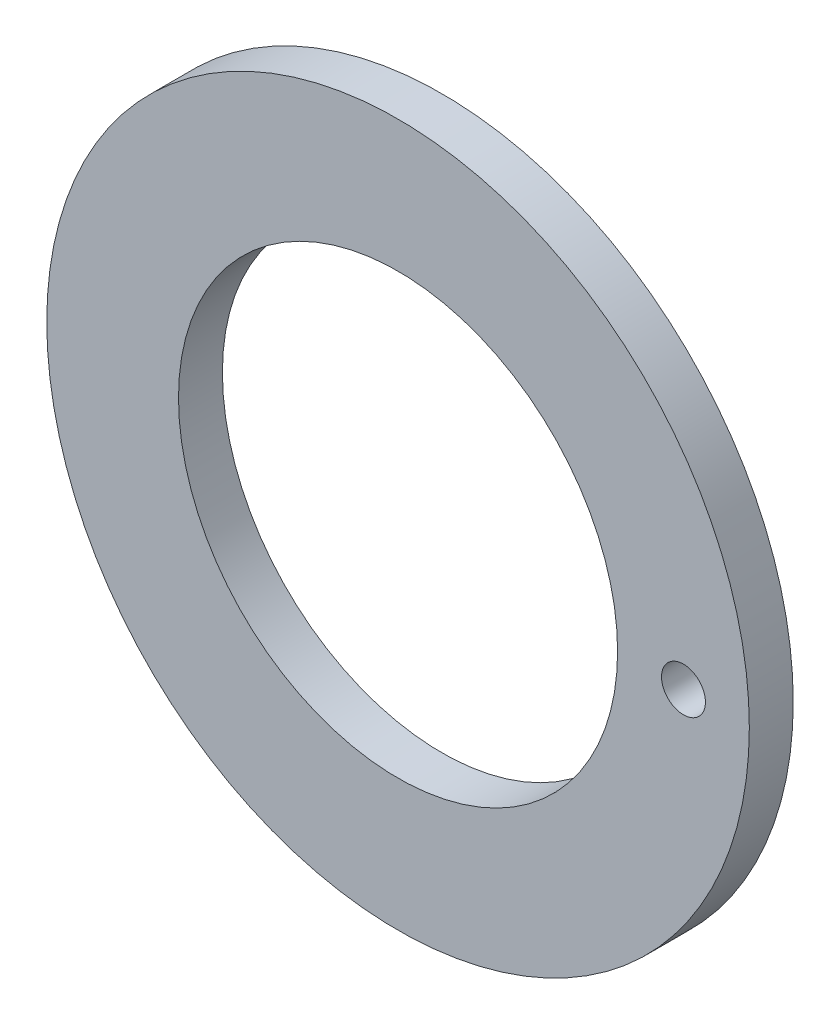
ISO-10303-21;
HEADER;
FILE_DESCRIPTION(('STEP AP214'),'2;1');
FILE_NAME('part.step','',(''),(''),'','','');
FILE_SCHEMA(('AUTOMOTIVE_DESIGN { 1 0 10303 214 1 1 1 1 }'));
ENDSEC;
DATA;
#1=APPLICATION_CONTEXT('core data for automotive mechanical design processes');
#2=APPLICATION_PROTOCOL_DEFINITION('international standard','automotive_design',2000,#1);
#3=PRODUCT_CONTEXT('',#1,'mechanical');
#4=PRODUCT('Part','Part','',(#3));
#5=PRODUCT_RELATED_PRODUCT_CATEGORY('part','',(#4));
#6=PRODUCT_DEFINITION_FORMATION('','',#4);
#7=PRODUCT_DEFINITION_CONTEXT('part definition',#1,'design');
#8=PRODUCT_DEFINITION('design','',#6,#7);
#9=PRODUCT_DEFINITION_SHAPE('','',#8);
#10=(LENGTH_UNIT() NAMED_UNIT(*) SI_UNIT(.MILLI.,.METRE.));
#11=(NAMED_UNIT(*) PLANE_ANGLE_UNIT() SI_UNIT($,.RADIAN.));
#12=(NAMED_UNIT(*) SI_UNIT($,.STERADIAN.) SOLID_ANGLE_UNIT());
#13=UNCERTAINTY_MEASURE_WITH_UNIT(LENGTH_MEASURE(1.E-05),#10,'distance_accuracy_value','');
#14=(GEOMETRIC_REPRESENTATION_CONTEXT(3) GLOBAL_UNCERTAINTY_ASSIGNED_CONTEXT((#13)) GLOBAL_UNIT_ASSIGNED_CONTEXT((#10,
#11,#12)) REPRESENTATION_CONTEXT('',''));
#15=CARTESIAN_POINT('',(0.,0.,0.));
#16=DIRECTION('',(0.,0.,1.));
#17=DIRECTION('',(1.,0.,0.));
#18=AXIS2_PLACEMENT_3D('',#15,#16,#17);
#19=CARTESIAN_POINT('',(0.,0.,0.75));
#20=DIRECTION('',(0.,0.,1.));
#21=DIRECTION('',(1.,0.,0.));
#22=AXIS2_PLACEMENT_3D('',#19,#20,#21);
#23=PLANE('',#22);
#24=CARTESIAN_POINT('',(9.75,0.,0.75));
#25=DIRECTION('',(0.,0.,1.));
#26=DIRECTION('',(1.,0.,0.));
#27=AXIS2_PLACEMENT_3D('',#24,#25,#26);
#28=CIRCLE('',#27,0.75);
#29=CARTESIAN_POINT('',(10.5,0.,0.75));
#30=VERTEX_POINT('',#29);
#31=EDGE_CURVE('E68',#30,#30,#28,.T.);
#32=ORIENTED_EDGE('',*,*,#31,.F.);
#33=EDGE_LOOP('',(#32));
#34=FACE_BOUND('',#33,.T.);
#35=CARTESIAN_POINT('',(0.,0.,0.75));
#36=DIRECTION('',(0.,0.,1.));
#37=DIRECTION('',(1.,0.,0.));
#38=AXIS2_PLACEMENT_3D('',#35,#36,#37);
#39=CIRCLE('',#38,12.);
#40=CARTESIAN_POINT('',(12.,0.,0.75));
#41=VERTEX_POINT('',#40);
#42=EDGE_CURVE('E10',#41,#41,#39,.T.);
#43=ORIENTED_EDGE('',*,*,#42,.T.);
#44=EDGE_LOOP('',(#43));
#45=FACE_BOUND('',#44,.T.);
#46=CARTESIAN_POINT('',(0.,0.,0.75));
#47=DIRECTION('',(0.,0.,1.));
#48=DIRECTION('',(1.,0.,0.));
#49=AXIS2_PLACEMENT_3D('',#46,#47,#48);
#50=CIRCLE('',#49,7.5);
#51=CARTESIAN_POINT('',(7.5,0.,0.75));
#52=VERTEX_POINT('',#51);
#53=EDGE_CURVE('E55',#52,#52,#50,.T.);
#54=ORIENTED_EDGE('',*,*,#53,.F.);
#55=EDGE_LOOP('',(#54));
#56=FACE_BOUND('',#55,.T.);
#57=ADVANCED_FACE('F41',(#34,#45,#56),#23,.T.);
#58=CARTESIAN_POINT('',(0.,0.,-0.75));
#59=DIRECTION('',(0.,0.,1.));
#60=DIRECTION('',(1.,0.,0.));
#61=AXIS2_PLACEMENT_3D('',#58,#59,#60);
#62=PLANE('',#61);
#63=CARTESIAN_POINT('',(9.75,0.,-0.75));
#64=DIRECTION('',(0.,0.,1.));
#65=DIRECTION('',(1.,0.,0.));
#66=AXIS2_PLACEMENT_3D('',#63,#64,#65);
#67=CIRCLE('',#66,0.75);
#68=CARTESIAN_POINT('',(10.5,0.,-0.75));
#69=VERTEX_POINT('',#68);
#70=EDGE_CURVE('E61',#69,#69,#67,.T.);
#71=ORIENTED_EDGE('',*,*,#70,.T.);
#72=EDGE_LOOP('',(#71));
#73=FACE_BOUND('',#72,.T.);
#74=CARTESIAN_POINT('',(0.,0.,-0.75));
#75=DIRECTION('',(0.,0.,1.));
#76=DIRECTION('',(1.,0.,0.));
#77=AXIS2_PLACEMENT_3D('',#74,#75,#76);
#78=CIRCLE('',#77,12.);
#79=CARTESIAN_POINT('',(12.,0.,-0.75));
#80=VERTEX_POINT('',#79);
#81=EDGE_CURVE('E45',#80,#80,#78,.T.);
#82=ORIENTED_EDGE('',*,*,#81,.F.);
#83=EDGE_LOOP('',(#82));
#84=FACE_BOUND('',#83,.T.);
#85=CARTESIAN_POINT('',(0.,0.,-0.75));
#86=DIRECTION('',(0.,0.,1.));
#87=DIRECTION('',(1.,0.,0.));
#88=AXIS2_PLACEMENT_3D('',#85,#86,#87);
#89=CIRCLE('',#88,7.5);
#90=CARTESIAN_POINT('',(7.5,0.,-0.75));
#91=VERTEX_POINT('',#90);
#92=EDGE_CURVE('E57',#91,#91,#89,.T.);
#93=ORIENTED_EDGE('',*,*,#92,.T.);
#94=EDGE_LOOP('',(#93));
#95=FACE_BOUND('',#94,.T.);
#96=ADVANCED_FACE('F77',(#73,#84,#95),#62,.F.);
#97=CARTESIAN_POINT('',(0.,0.,0.75));
#98=DIRECTION('',(0.,0.,-1.));
#99=DIRECTION('',(-1.,0.,0.));
#100=AXIS2_PLACEMENT_3D('',#97,#98,#99);
#101=CYLINDRICAL_SURFACE('',#100,12.);
#102=ORIENTED_EDGE('',*,*,#42,.F.);
#103=EDGE_LOOP('',(#102));
#104=FACE_BOUND('',#103,.T.);
#105=ORIENTED_EDGE('',*,*,#81,.T.);
#106=EDGE_LOOP('',(#105));
#107=FACE_BOUND('',#106,.T.);
#108=ADVANCED_FACE('F43',(#104,#107),#101,.T.);
#109=CARTESIAN_POINT('',(0.,0.,0.75));
#110=DIRECTION('',(0.,0.,-1.));
#111=DIRECTION('',(-1.,0.,0.));
#112=AXIS2_PLACEMENT_3D('',#109,#110,#111);
#113=CYLINDRICAL_SURFACE('',#112,7.5);
#114=ORIENTED_EDGE('',*,*,#53,.T.);
#115=EDGE_LOOP('',(#114));
#116=FACE_BOUND('',#115,.T.);
#117=ORIENTED_EDGE('',*,*,#92,.F.);
#118=EDGE_LOOP('',(#117));
#119=FACE_BOUND('',#118,.T.);
#120=ADVANCED_FACE('F82',(#116,#119),#113,.F.);
#121=CARTESIAN_POINT('',(9.75,0.,-0.75));
#122=DIRECTION('',(0.,0.,1.));
#123=DIRECTION('',(1.,0.,0.));
#124=AXIS2_PLACEMENT_3D('',#121,#122,#123);
#125=CYLINDRICAL_SURFACE('',#124,0.75);
#126=ORIENTED_EDGE('',*,*,#70,.F.);
#127=EDGE_LOOP('',(#126));
#128=FACE_BOUND('',#127,.T.);
#129=ORIENTED_EDGE('',*,*,#31,.T.);
#130=EDGE_LOOP('',(#129));
#131=FACE_BOUND('',#130,.T.);
#132=ADVANCED_FACE('F74',(#128,#131),#125,.F.);
#133=CLOSED_SHELL('',(#57,#96,#108,#120,#132));
#134=MANIFOLD_SOLID_BREP('B2',#133);
#135=ADVANCED_BREP_SHAPE_REPRESENTATION('',(#18,#134),#14);
#136=SHAPE_DEFINITION_REPRESENTATION(#9,#135);
ENDSEC;
END-ISO-10303-21;
